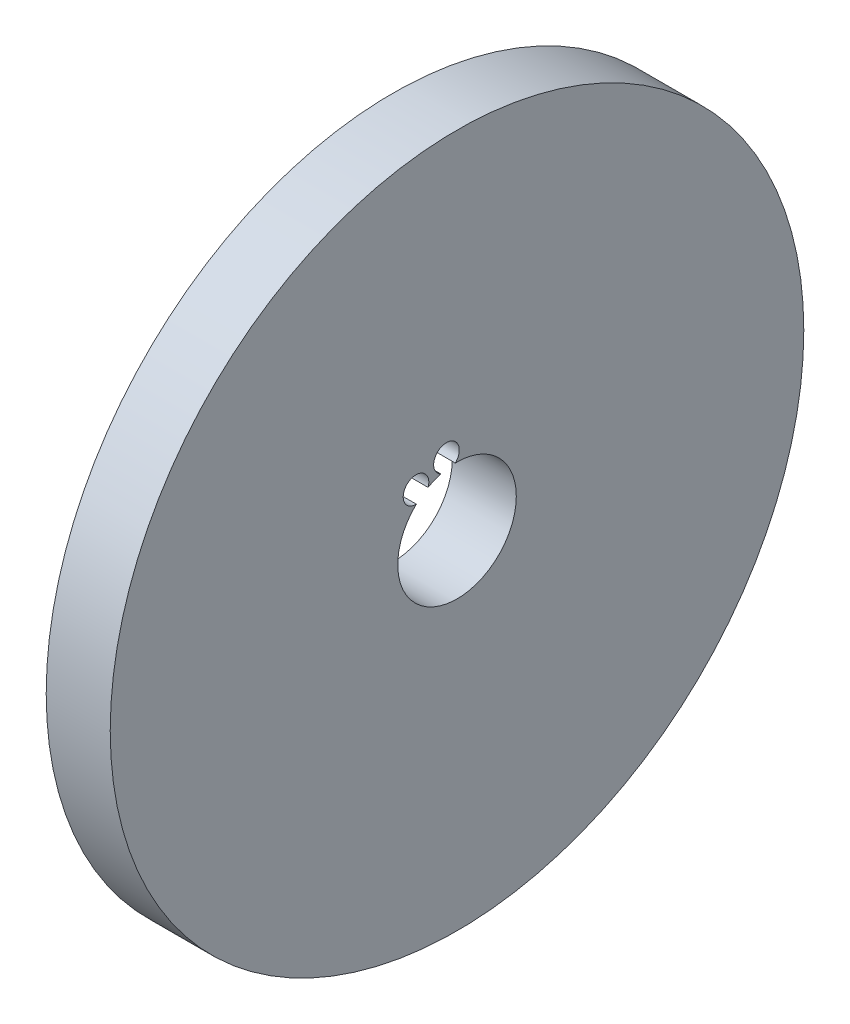
ISO-10303-21;
HEADER;
FILE_DESCRIPTION(('STEP AP214'),'2;1');
FILE_NAME('part.step','',(''),(''),'','','');
FILE_SCHEMA(('AUTOMOTIVE_DESIGN { 1 0 10303 214 1 1 1 1 }'));
ENDSEC;
DATA;
#1=APPLICATION_CONTEXT('core data for automotive mechanical design processes');
#2=APPLICATION_PROTOCOL_DEFINITION('international standard','automotive_design',2000,#1);
#3=PRODUCT_CONTEXT('',#1,'mechanical');
#4=PRODUCT('Part','Part','',(#3));
#5=PRODUCT_RELATED_PRODUCT_CATEGORY('part','',(#4));
#6=PRODUCT_DEFINITION_FORMATION('','',#4);
#7=PRODUCT_DEFINITION_CONTEXT('part definition',#1,'design');
#8=PRODUCT_DEFINITION('design','',#6,#7);
#9=PRODUCT_DEFINITION_SHAPE('','',#8);
#10=(LENGTH_UNIT() NAMED_UNIT(*) SI_UNIT(.MILLI.,.METRE.));
#11=(NAMED_UNIT(*) PLANE_ANGLE_UNIT() SI_UNIT($,.RADIAN.));
#12=(NAMED_UNIT(*) SI_UNIT($,.STERADIAN.) SOLID_ANGLE_UNIT());
#13=UNCERTAINTY_MEASURE_WITH_UNIT(LENGTH_MEASURE(1.E-05),#10,'distance_accuracy_value','');
#14=(GEOMETRIC_REPRESENTATION_CONTEXT(3) GLOBAL_UNCERTAINTY_ASSIGNED_CONTEXT((#13)) GLOBAL_UNIT_ASSIGNED_CONTEXT((#10,
#11,#12)) REPRESENTATION_CONTEXT('',''));
#15=CARTESIAN_POINT('',(0.,0.,0.));
#16=DIRECTION('',(0.,0.,1.));
#17=DIRECTION('',(1.,0.,0.));
#18=AXIS2_PLACEMENT_3D('',#15,#16,#17);
#19=CARTESIAN_POINT('',(-110.,0.,0.));
#20=DIRECTION('',(-1.,0.,0.));
#21=DIRECTION('',(0.,0.,1.));
#22=AXIS2_PLACEMENT_3D('',#19,#20,#21);
#23=CYLINDRICAL_SURFACE('',#22,11.1125);
#24=DIRECTION('',(-1.,0.,0.));
#25=VECTOR('',#24,1.);
#26=CARTESIAN_POINT('',(12.85,11.107733606024,0.325438761681619));
#27=LINE('',#26,#25);
#28=CARTESIAN_POINT('',(13.7,11.107733606024,0.325438761681617));
#29=VERTEX_POINT('',#28);
#30=CARTESIAN_POINT('',(25.7,11.107733606024,0.325438761681617));
#31=VERTEX_POINT('',#30);
#32=EDGE_CURVE('E47',#29,#31,#27,.F.);
#33=ORIENTED_EDGE('',*,*,#32,.F.);
#34=CARTESIAN_POINT('',(13.7,0.,0.));
#35=DIRECTION('',(-1.,0.,0.));
#36=DIRECTION('',(0.,0.,1.));
#37=AXIS2_PLACEMENT_3D('',#34,#35,#36);
#38=CIRCLE('',#37,11.1125);
#39=CARTESIAN_POINT('',(13.7,8.08447371167931,7.62423380118725));
#40=VERTEX_POINT('',#39);
#41=EDGE_CURVE('E84',#29,#40,#38,.T.);
#42=ORIENTED_EDGE('',*,*,#41,.T.);
#43=DIRECTION('',(-1.,0.,0.));
#44=VECTOR('',#43,1.);
#45=CARTESIAN_POINT('',(12.85,8.08447371167931,7.62423380118725));
#46=LINE('',#45,#44);
#47=CARTESIAN_POINT('',(25.7,8.08447371167931,7.62423380118725));
#48=VERTEX_POINT('',#47);
#49=EDGE_CURVE('E72',#48,#40,#46,.T.);
#50=ORIENTED_EDGE('',*,*,#49,.F.);
#51=CARTESIAN_POINT('',(25.7,0.,0.));
#52=DIRECTION('',(-1.,0.,0.));
#53=DIRECTION('',(0.,0.,1.));
#54=AXIS2_PLACEMENT_3D('',#51,#52,#53);
#55=CIRCLE('',#54,11.1125);
#56=EDGE_CURVE('E82',#31,#48,#55,.T.);
#57=ORIENTED_EDGE('',*,*,#56,.F.);
#58=EDGE_LOOP('',(#33,#42,#50,#57));
#59=FACE_BOUND('',#58,.T.);
#60=ADVANCED_FACE('F33',(#59),#23,.F.);
#61=DIRECTION('',(-1.,0.,0.));
#62=VECTOR('',#61,1.);
#63=CARTESIAN_POINT('',(12.85,10.6915995344499,3.02941506646924));
#64=LINE('',#63,#62);
#65=CARTESIAN_POINT('',(25.7,10.6915995344499,3.02941506646924));
#66=VERTEX_POINT('',#65);
#67=CARTESIAN_POINT('',(13.7,10.6915995344499,3.02941506646924));
#68=VERTEX_POINT('',#67);
#69=EDGE_CURVE('E102',#66,#68,#64,.T.);
#70=ORIENTED_EDGE('',*,*,#69,.F.);
#71=CARTESIAN_POINT('',(25.7,9.70222246906955,5.41798259601136));
#72=VERTEX_POINT('',#71);
#73=EDGE_CURVE('E89',#72,#66,#55,.T.);
#74=ORIENTED_EDGE('',*,*,#73,.F.);
#75=DIRECTION('',(-1.,0.,0.));
#76=VECTOR('',#75,1.);
#77=CARTESIAN_POINT('',(12.85,9.70222246906955,5.41798259601136));
#78=LINE('',#77,#76);
#79=CARTESIAN_POINT('',(13.7,9.70222246906955,5.41798259601136));
#80=VERTEX_POINT('',#79);
#81=EDGE_CURVE('E55',#80,#72,#78,.F.);
#82=ORIENTED_EDGE('',*,*,#81,.F.);
#83=EDGE_CURVE('E78',#80,#68,#38,.T.);
#84=ORIENTED_EDGE('',*,*,#83,.T.);
#85=EDGE_LOOP('',(#70,#74,#82,#84));
#86=FACE_BOUND('',#85,.T.);
#87=ADVANCED_FACE('F101',(#86),#23,.F.);
#88=CARTESIAN_POINT('',(13.7,65.,0.));
#89=DIRECTION('',(1.,0.,0.));
#90=DIRECTION('',(0.,0.,-1.));
#91=AXIS2_PLACEMENT_3D('',#88,#89,#90);
#92=PLANE('',#91);
#93=CARTESIAN_POINT('',(13.7,12.8487337040411,1.97738266469541));
#94=DIRECTION('',(1.,0.,0.));
#95=DIRECTION('',(0.,0.,-1.));
#96=AXIS2_PLACEMENT_3D('',#93,#94,#95);
#97=CIRCLE('',#96,2.4);
#98=EDGE_CURVE('E106',#68,#29,#97,.F.);
#99=ORIENTED_EDGE('',*,*,#98,.F.);
#100=ORIENTED_EDGE('',*,*,#83,.F.);
#101=CARTESIAN_POINT('',(13.7,10.4836474229945,7.68720604058077));
#102=DIRECTION('',(1.,0.,0.));
#103=DIRECTION('',(0.,0.,-1.));
#104=AXIS2_PLACEMENT_3D('',#101,#102,#103);
#105=CIRCLE('',#104,2.4);
#106=EDGE_CURVE('E85',#40,#80,#105,.F.);
#107=ORIENTED_EDGE('',*,*,#106,.F.);
#108=ORIENTED_EDGE('',*,*,#41,.F.);
#109=EDGE_LOOP('',(#99,#100,#107,#108));
#110=FACE_BOUND('',#109,.T.);
#111=CARTESIAN_POINT('',(13.7,0.,0.));
#112=DIRECTION('',(-1.,0.,0.));
#113=DIRECTION('',(0.,0.,1.));
#114=AXIS2_PLACEMENT_3D('',#111,#112,#113);
#115=CIRCLE('',#114,65.);
#116=CARTESIAN_POINT('',(13.7,0.,65.));
#117=VERTEX_POINT('',#116);
#118=EDGE_CURVE('E93',#117,#117,#115,.T.);
#119=ORIENTED_EDGE('',*,*,#118,.T.);
#120=EDGE_LOOP('',(#119));
#121=FACE_BOUND('',#120,.T.);
#122=ADVANCED_FACE('F35',(#110,#121),#92,.F.);
#123=CARTESIAN_POINT('',(25.7,11.1125,0.));
#124=DIRECTION('',(-1.,0.,0.));
#125=DIRECTION('',(0.,0.,1.));
#126=AXIS2_PLACEMENT_3D('',#123,#124,#125);
#127=PLANE('',#126);
#128=CARTESIAN_POINT('',(25.7,12.8487337040411,1.97738266469541));
#129=DIRECTION('',(-1.,0.,0.));
#130=DIRECTION('',(0.,0.,1.));
#131=AXIS2_PLACEMENT_3D('',#128,#129,#130);
#132=CIRCLE('',#131,2.4);
#133=EDGE_CURVE('E11',#31,#66,#132,.F.);
#134=ORIENTED_EDGE('',*,*,#133,.F.);
#135=ORIENTED_EDGE('',*,*,#56,.T.);
#136=CARTESIAN_POINT('',(25.7,10.4836474229945,7.68720604058077));
#137=DIRECTION('',(-1.,0.,0.));
#138=DIRECTION('',(0.,0.,1.));
#139=AXIS2_PLACEMENT_3D('',#136,#137,#138);
#140=CIRCLE('',#139,2.4);
#141=EDGE_CURVE('E41',#72,#48,#140,.F.);
#142=ORIENTED_EDGE('',*,*,#141,.F.);
#143=ORIENTED_EDGE('',*,*,#73,.T.);
#144=EDGE_LOOP('',(#134,#135,#142,#143));
#145=FACE_BOUND('',#144,.T.);
#146=CARTESIAN_POINT('',(25.7,0.,0.));
#147=DIRECTION('',(-1.,0.,0.));
#148=DIRECTION('',(0.,0.,1.));
#149=AXIS2_PLACEMENT_3D('',#146,#147,#148);
#150=CIRCLE('',#149,65.);
#151=CARTESIAN_POINT('',(25.7,0.,65.));
#152=VERTEX_POINT('',#151);
#153=EDGE_CURVE('E90',#152,#152,#150,.T.);
#154=ORIENTED_EDGE('',*,*,#153,.F.);
#155=EDGE_LOOP('',(#154));
#156=FACE_BOUND('',#155,.T.);
#157=ADVANCED_FACE('F87',(#145,#156),#127,.F.);
#158=CARTESIAN_POINT('',(-110.,0.,0.));
#159=DIRECTION('',(-1.,0.,0.));
#160=DIRECTION('',(0.,0.,1.));
#161=AXIS2_PLACEMENT_3D('',#158,#159,#160);
#162=CYLINDRICAL_SURFACE('',#161,65.);
#163=ORIENTED_EDGE('',*,*,#118,.F.);
#164=EDGE_LOOP('',(#163));
#165=FACE_BOUND('',#164,.T.);
#166=ORIENTED_EDGE('',*,*,#153,.T.);
#167=EDGE_LOOP('',(#166));
#168=FACE_BOUND('',#167,.T.);
#169=ADVANCED_FACE('F114',(#165,#168),#162,.T.);
#170=CARTESIAN_POINT('',(13.7,10.4836474229945,7.68720604058077));
#171=DIRECTION('',(-1.,0.,0.));
#172=DIRECTION('',(0.,0.,1.));
#173=AXIS2_PLACEMENT_3D('',#170,#171,#172);
#174=CYLINDRICAL_SURFACE('',#173,2.4);
#175=ORIENTED_EDGE('',*,*,#81,.T.);
#176=ORIENTED_EDGE('',*,*,#141,.T.);
#177=ORIENTED_EDGE('',*,*,#49,.T.);
#178=ORIENTED_EDGE('',*,*,#106,.T.);
#179=EDGE_LOOP('',(#175,#176,#177,#178));
#180=FACE_BOUND('',#179,.T.);
#181=ADVANCED_FACE('F71',(#180),#174,.F.);
#182=CARTESIAN_POINT('',(13.7,12.8487337040411,1.97738266469541));
#183=DIRECTION('',(-1.,0.,0.));
#184=DIRECTION('',(0.,0.,1.));
#185=AXIS2_PLACEMENT_3D('',#182,#183,#184);
#186=CYLINDRICAL_SURFACE('',#185,2.4);
#187=ORIENTED_EDGE('',*,*,#32,.T.);
#188=ORIENTED_EDGE('',*,*,#133,.T.);
#189=ORIENTED_EDGE('',*,*,#69,.T.);
#190=ORIENTED_EDGE('',*,*,#98,.T.);
#191=EDGE_LOOP('',(#187,#188,#189,#190));
#192=FACE_BOUND('',#191,.T.);
#193=ADVANCED_FACE('F148',(#192),#186,.F.);
#194=CLOSED_SHELL('',(#60,#87,#122,#157,#169,#181,#193));
#195=MANIFOLD_SOLID_BREP('B2',#194);
#196=ADVANCED_BREP_SHAPE_REPRESENTATION('',(#18,#195),#14);
#197=SHAPE_DEFINITION_REPRESENTATION(#9,#196);
ENDSEC;
END-ISO-10303-21;
